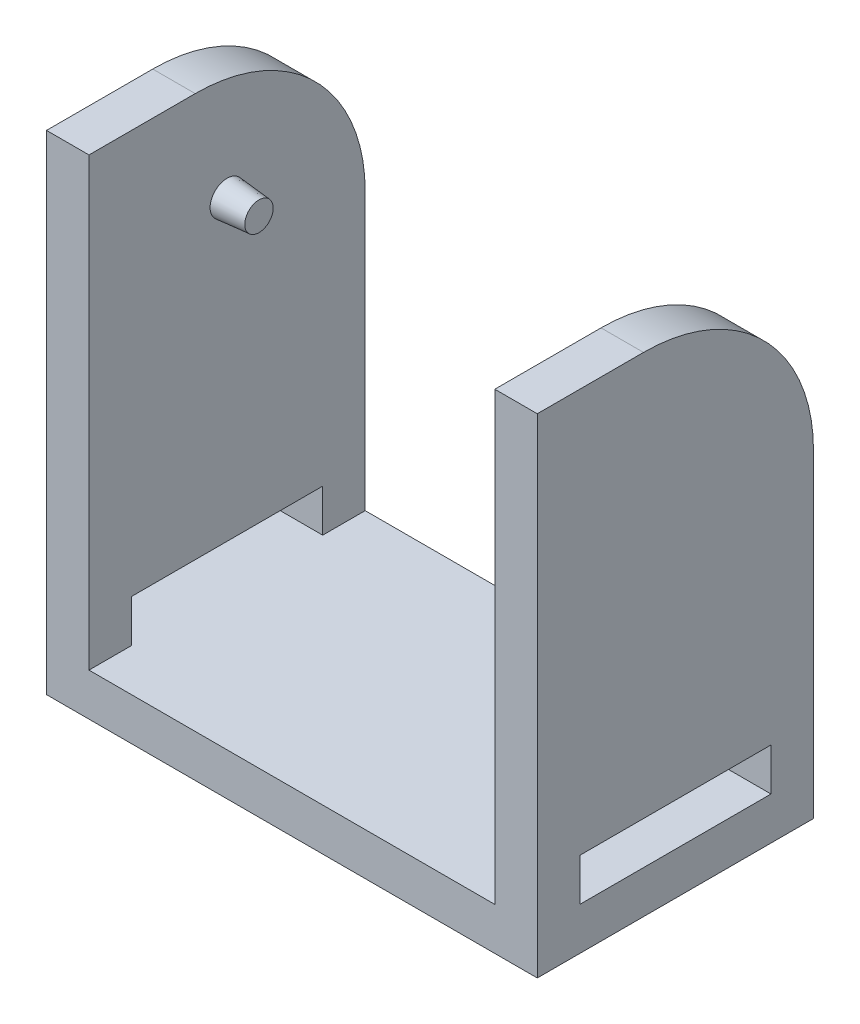
ISO-10303-21;
HEADER;
FILE_DESCRIPTION(('STEP AP214'),'2;1');
FILE_NAME('part.step','',(''),(''),'','','');
FILE_SCHEMA(('AUTOMOTIVE_DESIGN { 1 0 10303 214 1 1 1 1 }'));
ENDSEC;
DATA;
#1=APPLICATION_CONTEXT('core data for automotive mechanical design processes');
#2=APPLICATION_PROTOCOL_DEFINITION('international standard','automotive_design',2000,#1);
#3=PRODUCT_CONTEXT('',#1,'mechanical');
#4=PRODUCT('Part','Part','',(#3));
#5=PRODUCT_RELATED_PRODUCT_CATEGORY('part','',(#4));
#6=PRODUCT_DEFINITION_FORMATION('','',#4);
#7=PRODUCT_DEFINITION_CONTEXT('part definition',#1,'design');
#8=PRODUCT_DEFINITION('design','',#6,#7);
#9=PRODUCT_DEFINITION_SHAPE('','',#8);
#10=(LENGTH_UNIT() NAMED_UNIT(*) SI_UNIT(.MILLI.,.METRE.));
#11=(NAMED_UNIT(*) PLANE_ANGLE_UNIT() SI_UNIT($,.RADIAN.));
#12=(NAMED_UNIT(*) SI_UNIT($,.STERADIAN.) SOLID_ANGLE_UNIT());
#13=UNCERTAINTY_MEASURE_WITH_UNIT(LENGTH_MEASURE(1.E-05),#10,'distance_accuracy_value','');
#14=(GEOMETRIC_REPRESENTATION_CONTEXT(3) GLOBAL_UNCERTAINTY_ASSIGNED_CONTEXT((#13)) GLOBAL_UNIT_ASSIGNED_CONTEXT((#10,
#11,#12)) REPRESENTATION_CONTEXT('',''));
#15=CARTESIAN_POINT('',(0.,0.,0.));
#16=DIRECTION('',(0.,0.,1.));
#17=DIRECTION('',(1.,0.,0.));
#18=AXIS2_PLACEMENT_3D('',#15,#16,#17);
#19=CARTESIAN_POINT('',(11.55,15.,1.5));
#20=DIRECTION('',(1.,0.,0.));
#21=DIRECTION('',(0.,0.,1.));
#22=AXIS2_PLACEMENT_3D('',#19,#20,#21);
#23=PLANE('',#22);
#24=DIRECTION('',(0.,0.,1.));
#25=VECTOR('',#24,1.);
#26=CARTESIAN_POINT('',(11.55,0.,-6.5));
#27=LINE('',#26,#25);
#28=CARTESIAN_POINT('',(11.55,0.,-6.5));
#29=VERTEX_POINT('',#28);
#30=CARTESIAN_POINT('',(11.55,0.,6.5));
#31=VERTEX_POINT('',#30);
#32=EDGE_CURVE('E216',#29,#31,#27,.T.);
#33=ORIENTED_EDGE('',*,*,#32,.F.);
#34=DIRECTION('',(0.,-1.,0.));
#35=VECTOR('',#34,1.);
#36=CARTESIAN_POINT('',(11.55,14.9999999999999,-6.5));
#37=LINE('',#36,#35);
#38=CARTESIAN_POINT('',(11.55,14.9999999999999,-6.5));
#39=VERTEX_POINT('',#38);
#40=EDGE_CURVE('E220',#39,#29,#37,.T.);
#41=ORIENTED_EDGE('',*,*,#40,.F.);
#42=CARTESIAN_POINT('',(11.55,15.,1.5));
#43=DIRECTION('',(-1.,0.,0.));
#44=DIRECTION('',(0.,0.,1.));
#45=AXIS2_PLACEMENT_3D('',#42,#43,#44);
#46=CIRCLE('',#45,8.);
#47=CARTESIAN_POINT('',(11.55,23.,1.50000000000006));
#48=VERTEX_POINT('',#47);
#49=EDGE_CURVE('E225',#48,#39,#46,.T.);
#50=ORIENTED_EDGE('',*,*,#49,.F.);
#51=DIRECTION('',(0.,0.,-1.));
#52=VECTOR('',#51,1.);
#53=CARTESIAN_POINT('',(11.55,23.,6.5));
#54=LINE('',#53,#52);
#55=CARTESIAN_POINT('',(11.55,23.,6.5));
#56=VERTEX_POINT('',#55);
#57=EDGE_CURVE('E229',#56,#48,#54,.T.);
#58=ORIENTED_EDGE('',*,*,#57,.F.);
#59=DIRECTION('',(0.,1.,0.));
#60=VECTOR('',#59,1.);
#61=CARTESIAN_POINT('',(11.55,0.,6.5));
#62=LINE('',#61,#60);
#63=EDGE_CURVE('E233',#31,#56,#62,.T.);
#64=ORIENTED_EDGE('',*,*,#63,.F.);
#65=EDGE_LOOP('',(#33,#41,#50,#58,#64));
#66=FACE_BOUND('',#65,.T.);
#67=DIRECTION('',(0.,0.,-1.));
#68=VECTOR('',#67,1.);
#69=CARTESIAN_POINT('',(11.55,2.,4.5));
#70=LINE('',#69,#68);
#71=CARTESIAN_POINT('',(11.55,2.,4.5));
#72=VERTEX_POINT('',#71);
#73=CARTESIAN_POINT('',(11.55,2.,-4.5));
#74=VERTEX_POINT('',#73);
#75=EDGE_CURVE('E172',#72,#74,#70,.T.);
#76=ORIENTED_EDGE('',*,*,#75,.F.);
#77=DIRECTION('',(0.,-1.,0.));
#78=VECTOR('',#77,1.);
#79=CARTESIAN_POINT('',(11.55,2.,4.5));
#80=LINE('',#79,#78);
#81=CARTESIAN_POINT('',(11.55,4.,4.5));
#82=VERTEX_POINT('',#81);
#83=EDGE_CURVE('E179',#82,#72,#80,.T.);
#84=ORIENTED_EDGE('',*,*,#83,.F.);
#85=DIRECTION('',(0.,0.,1.));
#86=VECTOR('',#85,1.);
#87=CARTESIAN_POINT('',(11.55,4.,4.5));
#88=LINE('',#87,#86);
#89=CARTESIAN_POINT('',(11.55,4.,-4.5));
#90=VERTEX_POINT('',#89);
#91=EDGE_CURVE('E186',#90,#82,#88,.T.);
#92=ORIENTED_EDGE('',*,*,#91,.F.);
#93=DIRECTION('',(0.,1.,0.));
#94=VECTOR('',#93,1.);
#95=CARTESIAN_POINT('',(11.55,2.,-4.5));
#96=LINE('',#95,#94);
#97=EDGE_CURVE('E57',#74,#90,#96,.T.);
#98=ORIENTED_EDGE('',*,*,#97,.F.);
#99=EDGE_LOOP('',(#76,#84,#92,#98));
#100=FACE_BOUND('',#99,.T.);
#101=ADVANCED_FACE('F41',(#66,#100),#23,.T.);
#102=CARTESIAN_POINT('',(9.55,15.,1.5));
#103=DIRECTION('',(1.,0.,0.));
#104=DIRECTION('',(0.,0.,1.));
#105=AXIS2_PLACEMENT_3D('',#102,#103,#104);
#106=PLANE('',#105);
#107=CARTESIAN_POINT('',(9.55,18.,0.));
#108=DIRECTION('',(1.,0.,0.));
#109=DIRECTION('',(0.,0.,-1.));
#110=AXIS2_PLACEMENT_3D('',#107,#108,#109);
#111=CIRCLE('',#110,0.8);
#112=CARTESIAN_POINT('',(9.55,18.,-0.8));
#113=VERTEX_POINT('',#112);
#114=EDGE_CURVE('E193',#113,#113,#111,.T.);
#115=ORIENTED_EDGE('',*,*,#114,.T.);
#116=EDGE_LOOP('',(#115));
#117=FACE_BOUND('',#116,.T.);
#118=DIRECTION('',(0.,-1.,0.));
#119=VECTOR('',#118,1.);
#120=CARTESIAN_POINT('',(9.55,2.,4.5));
#121=LINE('',#120,#119);
#122=CARTESIAN_POINT('',(9.55,4.,4.5));
#123=VERTEX_POINT('',#122);
#124=CARTESIAN_POINT('',(9.55,2.,4.5));
#125=VERTEX_POINT('',#124);
#126=EDGE_CURVE('E65',#123,#125,#121,.T.);
#127=ORIENTED_EDGE('',*,*,#126,.T.);
#128=DIRECTION('',(0.,0.,-1.));
#129=VECTOR('',#128,1.);
#130=CARTESIAN_POINT('',(9.55,2.,6.5));
#131=LINE('',#130,#129);
#132=CARTESIAN_POINT('',(9.55,2.,6.5));
#133=VERTEX_POINT('',#132);
#134=EDGE_CURVE('E174',#133,#125,#131,.T.);
#135=ORIENTED_EDGE('',*,*,#134,.F.);
#136=DIRECTION('',(0.,1.,0.));
#137=VECTOR('',#136,1.);
#138=CARTESIAN_POINT('',(9.55,0.,6.5));
#139=LINE('',#138,#137);
#140=CARTESIAN_POINT('',(9.55,23.,6.5));
#141=VERTEX_POINT('',#140);
#142=EDGE_CURVE('E221',#133,#141,#139,.T.);
#143=ORIENTED_EDGE('',*,*,#142,.T.);
#144=DIRECTION('',(0.,0.,-1.));
#145=VECTOR('',#144,1.);
#146=CARTESIAN_POINT('',(9.55,23.,6.5));
#147=LINE('',#146,#145);
#148=CARTESIAN_POINT('',(9.55,23.,1.50000000000006));
#149=VERTEX_POINT('',#148);
#150=EDGE_CURVE('E245',#141,#149,#147,.T.);
#151=ORIENTED_EDGE('',*,*,#150,.T.);
#152=CARTESIAN_POINT('',(9.55,15.,1.5));
#153=DIRECTION('',(-1.,0.,0.));
#154=DIRECTION('',(0.,0.,1.));
#155=AXIS2_PLACEMENT_3D('',#152,#153,#154);
#156=CIRCLE('',#155,8.);
#157=CARTESIAN_POINT('',(9.55,14.9999999999999,-6.5));
#158=VERTEX_POINT('',#157);
#159=EDGE_CURVE('E241',#149,#158,#156,.T.);
#160=ORIENTED_EDGE('',*,*,#159,.T.);
#161=DIRECTION('',(0.,-1.,0.));
#162=VECTOR('',#161,1.);
#163=CARTESIAN_POINT('',(9.55,14.9999999999999,-6.5));
#164=LINE('',#163,#162);
#165=CARTESIAN_POINT('',(9.55,2.,-6.5));
#166=VERTEX_POINT('',#165);
#167=EDGE_CURVE('E215',#158,#166,#164,.T.);
#168=ORIENTED_EDGE('',*,*,#167,.T.);
#169=CARTESIAN_POINT('',(9.55,2.,-4.5));
#170=VERTEX_POINT('',#169);
#171=EDGE_CURVE('E353',#170,#166,#131,.T.);
#172=ORIENTED_EDGE('',*,*,#171,.F.);
#173=DIRECTION('',(0.,1.,0.));
#174=VECTOR('',#173,1.);
#175=CARTESIAN_POINT('',(9.55,2.,-4.5));
#176=LINE('',#175,#174);
#177=CARTESIAN_POINT('',(9.55,4.,-4.5));
#178=VERTEX_POINT('',#177);
#179=EDGE_CURVE('E202',#170,#178,#176,.T.);
#180=ORIENTED_EDGE('',*,*,#179,.T.);
#181=DIRECTION('',(0.,0.,1.));
#182=VECTOR('',#181,1.);
#183=CARTESIAN_POINT('',(9.55,4.,4.5));
#184=LINE('',#183,#182);
#185=EDGE_CURVE('E198',#178,#123,#184,.T.);
#186=ORIENTED_EDGE('',*,*,#185,.T.);
#187=EDGE_LOOP('',(#127,#135,#143,#151,#160,#168,#172,#180,#186));
#188=FACE_BOUND('',#187,.T.);
#189=ADVANCED_FACE('F380',(#117,#188),#106,.F.);
#190=CARTESIAN_POINT('',(9.55,2.,6.5));
#191=DIRECTION('',(0.,0.,-1.));
#192=DIRECTION('',(-1.,0.,0.));
#193=AXIS2_PLACEMENT_3D('',#190,#191,#192);
#194=PLANE('',#193);
#195=DIRECTION('',(1.,0.,0.));
#196=VECTOR('',#195,1.);
#197=CARTESIAN_POINT('',(9.55,0.,6.5));
#198=LINE('',#197,#196);
#199=CARTESIAN_POINT('',(-11.55,0.,6.5));
#200=VERTEX_POINT('',#199);
#201=EDGE_CURVE('E345',#200,#31,#198,.T.);
#202=ORIENTED_EDGE('',*,*,#201,.T.);
#203=ORIENTED_EDGE('',*,*,#63,.T.);
#204=DIRECTION('',(-1.,0.,0.));
#205=VECTOR('',#204,1.);
#206=CARTESIAN_POINT('',(11.55,23.,6.5));
#207=LINE('',#206,#205);
#208=EDGE_CURVE('E237',#56,#141,#207,.T.);
#209=ORIENTED_EDGE('',*,*,#208,.T.);
#210=ORIENTED_EDGE('',*,*,#142,.F.);
#211=DIRECTION('',(1.,0.,0.));
#212=VECTOR('',#211,1.);
#213=CARTESIAN_POINT('',(9.55,2.,6.5));
#214=LINE('',#213,#212);
#215=CARTESIAN_POINT('',(-9.55,2.,6.5));
#216=VERTEX_POINT('',#215);
#217=EDGE_CURVE('E349',#216,#133,#214,.T.);
#218=ORIENTED_EDGE('',*,*,#217,.F.);
#219=DIRECTION('',(0.,1.,0.));
#220=VECTOR('',#219,1.);
#221=CARTESIAN_POINT('',(-9.55,0.,6.5));
#222=LINE('',#221,#220);
#223=CARTESIAN_POINT('',(-9.55,23.,6.5));
#224=VERTEX_POINT('',#223);
#225=EDGE_CURVE('E303',#216,#224,#222,.T.);
#226=ORIENTED_EDGE('',*,*,#225,.T.);
#227=DIRECTION('',(1.,0.,0.));
#228=VECTOR('',#227,1.);
#229=CARTESIAN_POINT('',(-11.55,23.,6.5));
#230=LINE('',#229,#228);
#231=CARTESIAN_POINT('',(-11.55,23.,6.5));
#232=VERTEX_POINT('',#231);
#233=EDGE_CURVE('E341',#232,#224,#230,.T.);
#234=ORIENTED_EDGE('',*,*,#233,.F.);
#235=DIRECTION('',(0.,1.,0.));
#236=VECTOR('',#235,1.);
#237=CARTESIAN_POINT('',(-11.55,0.,6.5));
#238=LINE('',#237,#236);
#239=EDGE_CURVE('E308',#200,#232,#238,.T.);
#240=ORIENTED_EDGE('',*,*,#239,.F.);
#241=EDGE_LOOP('',(#202,#203,#209,#210,#218,#226,#234,#240));
#242=FACE_BOUND('',#241,.T.);
#243=ADVANCED_FACE('F43',(#242),#194,.F.);
#244=CARTESIAN_POINT('',(9.55,2.,-6.5));
#245=DIRECTION('',(0.,0.,1.));
#246=DIRECTION('',(1.,0.,0.));
#247=AXIS2_PLACEMENT_3D('',#244,#245,#246);
#248=PLANE('',#247);
#249=DIRECTION('',(-1.,0.,0.));
#250=VECTOR('',#249,1.);
#251=CARTESIAN_POINT('',(9.55,0.,-6.5));
#252=LINE('',#251,#250);
#253=CARTESIAN_POINT('',(-11.55,0.,-6.5));
#254=VERTEX_POINT('',#253);
#255=EDGE_CURVE('E360',#29,#254,#252,.T.);
#256=ORIENTED_EDGE('',*,*,#255,.T.);
#257=DIRECTION('',(0.,-1.,0.));
#258=VECTOR('',#257,1.);
#259=CARTESIAN_POINT('',(-11.55,14.9999999999999,-6.5));
#260=LINE('',#259,#258);
#261=CARTESIAN_POINT('',(-11.55,14.9999999999999,-6.5));
#262=VERTEX_POINT('',#261);
#263=EDGE_CURVE('E318',#262,#254,#260,.T.);
#264=ORIENTED_EDGE('',*,*,#263,.F.);
#265=DIRECTION('',(1.,0.,0.));
#266=VECTOR('',#265,1.);
#267=CARTESIAN_POINT('',(-11.55,14.9999999999999,-6.5));
#268=LINE('',#267,#266);
#269=CARTESIAN_POINT('',(-9.55,14.9999999999999,-6.5));
#270=VERTEX_POINT('',#269);
#271=EDGE_CURVE('E322',#262,#270,#268,.T.);
#272=ORIENTED_EDGE('',*,*,#271,.T.);
#273=DIRECTION('',(0.,-1.,0.));
#274=VECTOR('',#273,1.);
#275=CARTESIAN_POINT('',(-9.55,14.9999999999999,-6.5));
#276=LINE('',#275,#274);
#277=CARTESIAN_POINT('',(-9.55,2.,-6.5));
#278=VERTEX_POINT('',#277);
#279=EDGE_CURVE('E309',#270,#278,#276,.T.);
#280=ORIENTED_EDGE('',*,*,#279,.T.);
#281=DIRECTION('',(-1.,0.,0.));
#282=VECTOR('',#281,1.);
#283=CARTESIAN_POINT('',(9.55,2.,-6.5));
#284=LINE('',#283,#282);
#285=EDGE_CURVE('E50',#166,#278,#284,.T.);
#286=ORIENTED_EDGE('',*,*,#285,.F.);
#287=ORIENTED_EDGE('',*,*,#167,.F.);
#288=DIRECTION('',(-1.,0.,0.));
#289=VECTOR('',#288,1.);
#290=CARTESIAN_POINT('',(11.55,14.9999999999999,-6.5));
#291=LINE('',#290,#289);
#292=EDGE_CURVE('E257',#39,#158,#291,.T.);
#293=ORIENTED_EDGE('',*,*,#292,.F.);
#294=ORIENTED_EDGE('',*,*,#40,.T.);
#295=EDGE_LOOP('',(#256,#264,#272,#280,#286,#287,#293,#294));
#296=FACE_BOUND('',#295,.T.);
#297=ADVANCED_FACE('F458',(#296),#248,.F.);
#298=CARTESIAN_POINT('',(0.,2.,0.));
#299=DIRECTION('',(0.,1.,0.));
#300=DIRECTION('',(0.,0.,1.));
#301=AXIS2_PLACEMENT_3D('',#298,#299,#300);
#302=PLANE('',#301);
#303=DIRECTION('',(0.,0.,1.));
#304=VECTOR('',#303,1.);
#305=CARTESIAN_POINT('',(-9.55,2.,6.5));
#306=LINE('',#305,#304);
#307=CARTESIAN_POINT('',(-9.55,2.,-4.5));
#308=VERTEX_POINT('',#307);
#309=EDGE_CURVE('E346',#278,#308,#306,.T.);
#310=ORIENTED_EDGE('',*,*,#309,.T.);
#311=DIRECTION('',(1.,0.,0.));
#312=VECTOR('',#311,1.);
#313=CARTESIAN_POINT('',(-20.7695444572929,2.,-4.5));
#314=LINE('',#313,#312);
#315=CARTESIAN_POINT('',(-11.55,2.,-4.5));
#316=VERTEX_POINT('',#315);
#317=EDGE_CURVE('E274',#316,#308,#314,.T.);
#318=ORIENTED_EDGE('',*,*,#317,.F.);
#319=DIRECTION('',(0.,0.,-1.));
#320=VECTOR('',#319,1.);
#321=CARTESIAN_POINT('',(-11.55,2.,4.5));
#322=LINE('',#321,#320);
#323=CARTESIAN_POINT('',(-11.55,2.,4.5));
#324=VERTEX_POINT('',#323);
#325=EDGE_CURVE('E264',#324,#316,#322,.T.);
#326=ORIENTED_EDGE('',*,*,#325,.F.);
#327=DIRECTION('',(1.,0.,0.));
#328=VECTOR('',#327,1.);
#329=CARTESIAN_POINT('',(-20.7695444572929,2.,4.5));
#330=LINE('',#329,#328);
#331=CARTESIAN_POINT('',(-9.55,2.,4.5));
#332=VERTEX_POINT('',#331);
#333=EDGE_CURVE('E279',#324,#332,#330,.T.);
#334=ORIENTED_EDGE('',*,*,#333,.T.);
#335=EDGE_CURVE('E350',#332,#216,#306,.T.);
#336=ORIENTED_EDGE('',*,*,#335,.T.);
#337=ORIENTED_EDGE('',*,*,#217,.T.);
#338=ORIENTED_EDGE('',*,*,#134,.T.);
#339=DIRECTION('',(-1.,0.,0.));
#340=VECTOR('',#339,1.);
#341=CARTESIAN_POINT('',(39.8695444572929,2.,4.5));
#342=LINE('',#341,#340);
#343=EDGE_CURVE('E167',#72,#125,#342,.T.);
#344=ORIENTED_EDGE('',*,*,#343,.F.);
#345=ORIENTED_EDGE('',*,*,#75,.T.);
#346=DIRECTION('',(-1.,0.,0.));
#347=VECTOR('',#346,1.);
#348=CARTESIAN_POINT('',(39.8695444572929,2.,-4.5));
#349=LINE('',#348,#347);
#350=EDGE_CURVE('E176',#74,#170,#349,.T.);
#351=ORIENTED_EDGE('',*,*,#350,.T.);
#352=ORIENTED_EDGE('',*,*,#171,.T.);
#353=ORIENTED_EDGE('',*,*,#285,.T.);
#354=EDGE_LOOP('',(#310,#318,#326,#334,#336,#337,#338,#344,#345,#351,#352,#353));
#355=FACE_BOUND('',#354,.T.);
#356=ADVANCED_FACE('F170',(#355),#302,.T.);
#357=CARTESIAN_POINT('',(0.,0.,0.));
#358=DIRECTION('',(0.,1.,0.));
#359=DIRECTION('',(0.,0.,1.));
#360=AXIS2_PLACEMENT_3D('',#357,#358,#359);
#361=PLANE('',#360);
#362=ORIENTED_EDGE('',*,*,#201,.F.);
#363=DIRECTION('',(0.,0.,1.));
#364=VECTOR('',#363,1.);
#365=CARTESIAN_POINT('',(-11.55,0.,-6.5));
#366=LINE('',#365,#364);
#367=EDGE_CURVE('E304',#254,#200,#366,.T.);
#368=ORIENTED_EDGE('',*,*,#367,.F.);
#369=ORIENTED_EDGE('',*,*,#255,.F.);
#370=ORIENTED_EDGE('',*,*,#32,.T.);
#371=EDGE_LOOP('',(#362,#368,#369,#370));
#372=FACE_BOUND('',#371,.T.);
#373=ADVANCED_FACE('F454',(#372),#361,.F.);
#374=CARTESIAN_POINT('',(-11.55,23.,6.5));
#375=DIRECTION('',(0.,-1.,0.));
#376=DIRECTION('',(0.,0.,-1.));
#377=AXIS2_PLACEMENT_3D('',#374,#375,#376);
#378=PLANE('',#377);
#379=DIRECTION('',(0.,0.,-1.));
#380=VECTOR('',#379,1.);
#381=CARTESIAN_POINT('',(-9.55,23.,6.5));
#382=LINE('',#381,#380);
#383=CARTESIAN_POINT('',(-9.55,23.,1.50000000000006));
#384=VERTEX_POINT('',#383);
#385=EDGE_CURVE('E325',#224,#384,#382,.T.);
#386=ORIENTED_EDGE('',*,*,#385,.T.);
#387=DIRECTION('',(1.,0.,0.));
#388=VECTOR('',#387,1.);
#389=CARTESIAN_POINT('',(-11.55,23.,1.50000000000006));
#390=LINE('',#389,#388);
#391=CARTESIAN_POINT('',(-11.55,23.,1.50000000000006));
#392=VERTEX_POINT('',#391);
#393=EDGE_CURVE('E337',#392,#384,#390,.T.);
#394=ORIENTED_EDGE('',*,*,#393,.F.);
#395=DIRECTION('',(0.,0.,-1.));
#396=VECTOR('',#395,1.);
#397=CARTESIAN_POINT('',(-11.55,23.,6.5));
#398=LINE('',#397,#396);
#399=EDGE_CURVE('E312',#232,#392,#398,.T.);
#400=ORIENTED_EDGE('',*,*,#399,.F.);
#401=ORIENTED_EDGE('',*,*,#233,.T.);
#402=EDGE_LOOP('',(#386,#394,#400,#401));
#403=FACE_BOUND('',#402,.T.);
#404=ADVANCED_FACE('F450',(#403),#378,.F.);
#405=CARTESIAN_POINT('',(-11.55,15.,1.5));
#406=DIRECTION('',(1.,0.,0.));
#407=DIRECTION('',(0.,0.,-1.));
#408=AXIS2_PLACEMENT_3D('',#405,#406,#407);
#409=CYLINDRICAL_SURFACE('',#408,8.);
#410=CARTESIAN_POINT('',(-9.55,15.,1.5));
#411=DIRECTION('',(-1.,0.,0.));
#412=DIRECTION('',(0.,0.,1.));
#413=AXIS2_PLACEMENT_3D('',#410,#411,#412);
#414=CIRCLE('',#413,8.);
#415=EDGE_CURVE('E328',#384,#270,#414,.T.);
#416=ORIENTED_EDGE('',*,*,#415,.T.);
#417=ORIENTED_EDGE('',*,*,#271,.F.);
#418=CARTESIAN_POINT('',(-11.55,15.,1.5));
#419=DIRECTION('',(-1.,0.,0.));
#420=DIRECTION('',(0.,0.,1.));
#421=AXIS2_PLACEMENT_3D('',#418,#419,#420);
#422=CIRCLE('',#421,8.);
#423=EDGE_CURVE('E315',#392,#262,#422,.T.);
#424=ORIENTED_EDGE('',*,*,#423,.F.);
#425=ORIENTED_EDGE('',*,*,#393,.T.);
#426=EDGE_LOOP('',(#416,#417,#424,#425));
#427=FACE_BOUND('',#426,.T.);
#428=ADVANCED_FACE('F443',(#427),#409,.T.);
#429=CARTESIAN_POINT('',(-11.55,15.,1.5));
#430=DIRECTION('',(-1.,0.,0.));
#431=DIRECTION('',(0.,0.,1.));
#432=AXIS2_PLACEMENT_3D('',#429,#430,#431);
#433=PLANE('',#432);
#434=ORIENTED_EDGE('',*,*,#325,.T.);
#435=DIRECTION('',(0.,1.,0.));
#436=VECTOR('',#435,1.);
#437=CARTESIAN_POINT('',(-11.55,2.,-4.5));
#438=LINE('',#437,#436);
#439=CARTESIAN_POINT('',(-11.55,4.,-4.5));
#440=VERTEX_POINT('',#439);
#441=EDGE_CURVE('E286',#316,#440,#438,.T.);
#442=ORIENTED_EDGE('',*,*,#441,.T.);
#443=DIRECTION('',(0.,0.,1.));
#444=VECTOR('',#443,1.);
#445=CARTESIAN_POINT('',(-11.55,4.,4.5));
#446=LINE('',#445,#444);
#447=CARTESIAN_POINT('',(-11.55,4.,4.5));
#448=VERTEX_POINT('',#447);
#449=EDGE_CURVE('E281',#440,#448,#446,.T.);
#450=ORIENTED_EDGE('',*,*,#449,.T.);
#451=DIRECTION('',(0.,-1.,0.));
#452=VECTOR('',#451,1.);
#453=CARTESIAN_POINT('',(-11.55,2.,4.5));
#454=LINE('',#453,#452);
#455=EDGE_CURVE('E275',#448,#324,#454,.T.);
#456=ORIENTED_EDGE('',*,*,#455,.T.);
#457=EDGE_LOOP('',(#434,#442,#450,#456));
#458=FACE_BOUND('',#457,.T.);
#459=ORIENTED_EDGE('',*,*,#367,.T.);
#460=ORIENTED_EDGE('',*,*,#239,.T.);
#461=ORIENTED_EDGE('',*,*,#399,.T.);
#462=ORIENTED_EDGE('',*,*,#423,.T.);
#463=ORIENTED_EDGE('',*,*,#263,.T.);
#464=EDGE_LOOP('',(#459,#460,#461,#462,#463));
#465=FACE_BOUND('',#464,.T.);
#466=ADVANCED_FACE('F440',(#458,#465),#433,.T.);
#467=CARTESIAN_POINT('',(-9.55,15.,1.5));
#468=DIRECTION('',(-1.,0.,0.));
#469=DIRECTION('',(0.,0.,1.));
#470=AXIS2_PLACEMENT_3D('',#467,#468,#469);
#471=PLANE('',#470);
#472=CARTESIAN_POINT('',(-9.55,18.,0.));
#473=DIRECTION('',(-1.,0.,0.));
#474=DIRECTION('',(0.,0.,1.));
#475=AXIS2_PLACEMENT_3D('',#472,#473,#474);
#476=CIRCLE('',#475,0.8);
#477=CARTESIAN_POINT('',(-9.55,18.,0.8));
#478=VERTEX_POINT('',#477);
#479=EDGE_CURVE('E11',#478,#478,#476,.F.);
#480=ORIENTED_EDGE('',*,*,#479,.F.);
#481=EDGE_LOOP('',(#480));
#482=FACE_BOUND('',#481,.T.);
#483=DIRECTION('',(0.,0.,1.));
#484=VECTOR('',#483,1.);
#485=CARTESIAN_POINT('',(-9.55,4.,4.5));
#486=LINE('',#485,#484);
#487=CARTESIAN_POINT('',(-9.55,4.,-4.5));
#488=VERTEX_POINT('',#487);
#489=CARTESIAN_POINT('',(-9.55,4.,4.5));
#490=VERTEX_POINT('',#489);
#491=EDGE_CURVE('E261',#488,#490,#486,.T.);
#492=ORIENTED_EDGE('',*,*,#491,.F.);
#493=DIRECTION('',(0.,1.,0.));
#494=VECTOR('',#493,1.);
#495=CARTESIAN_POINT('',(-9.55,2.,-4.5));
#496=LINE('',#495,#494);
#497=EDGE_CURVE('E265',#308,#488,#496,.T.);
#498=ORIENTED_EDGE('',*,*,#497,.F.);
#499=ORIENTED_EDGE('',*,*,#309,.F.);
#500=ORIENTED_EDGE('',*,*,#279,.F.);
#501=ORIENTED_EDGE('',*,*,#415,.F.);
#502=ORIENTED_EDGE('',*,*,#385,.F.);
#503=ORIENTED_EDGE('',*,*,#225,.F.);
#504=ORIENTED_EDGE('',*,*,#335,.F.);
#505=DIRECTION('',(0.,-1.,0.));
#506=VECTOR('',#505,1.);
#507=CARTESIAN_POINT('',(-9.55,2.,4.5));
#508=LINE('',#507,#506);
#509=EDGE_CURVE('E260',#490,#332,#508,.T.);
#510=ORIENTED_EDGE('',*,*,#509,.F.);
#511=EDGE_LOOP('',(#492,#498,#499,#500,#501,#502,#503,#504,#510));
#512=FACE_BOUND('',#511,.T.);
#513=ADVANCED_FACE('F373',(#482,#512),#471,.F.);
#514=CARTESIAN_POINT('',(-9.55,18.,0.));
#515=DIRECTION('',(-1.,0.,0.));
#516=DIRECTION('',(0.,0.,-1.));
#517=AXIS2_PLACEMENT_3D('',#514,#515,#516);
#518=CONICAL_SURFACE('',#517,0.8,0.0872664625997165);
#519=CARTESIAN_POINT('',(-8.05,18.,0.));
#520=DIRECTION('',(1.,0.,0.));
#521=DIRECTION('',(0.,0.,-1.));
#522=AXIS2_PLACEMENT_3D('',#519,#520,#521);
#523=CIRCLE('',#522,0.668767004711114);
#524=CARTESIAN_POINT('',(-8.05,18.,-0.668767004711114));
#525=VERTEX_POINT('',#524);
#526=EDGE_CURVE('E299',#525,#525,#523,.T.);
#527=ORIENTED_EDGE('',*,*,#526,.F.);
#528=EDGE_LOOP('',(#527));
#529=FACE_BOUND('',#528,.T.);
#530=ORIENTED_EDGE('',*,*,#479,.T.);
#531=EDGE_LOOP('',(#530));
#532=FACE_BOUND('',#531,.T.);
#533=ADVANCED_FACE('F435',(#529,#532),#518,.T.);
#534=CARTESIAN_POINT('',(-8.05,18.,0.));
#535=DIRECTION('',(1.,0.,0.));
#536=DIRECTION('',(0.,0.,-1.));
#537=AXIS2_PLACEMENT_3D('',#534,#535,#536);
#538=PLANE('',#537);
#539=ORIENTED_EDGE('',*,*,#526,.T.);
#540=EDGE_LOOP('',(#539));
#541=FACE_BOUND('',#540,.T.);
#542=ADVANCED_FACE('F431',(#541),#538,.T.);
#543=CARTESIAN_POINT('',(-20.7695444572929,2.,-4.5));
#544=DIRECTION('',(0.,0.,-1.));
#545=DIRECTION('',(-1.,0.,0.));
#546=AXIS2_PLACEMENT_3D('',#543,#544,#545);
#547=PLANE('',#546);
#548=ORIENTED_EDGE('',*,*,#317,.T.);
#549=ORIENTED_EDGE('',*,*,#497,.T.);
#550=DIRECTION('',(1.,0.,0.));
#551=VECTOR('',#550,1.);
#552=CARTESIAN_POINT('',(-20.7695444572929,4.,-4.5));
#553=LINE('',#552,#551);
#554=EDGE_CURVE('E285',#440,#488,#553,.T.);
#555=ORIENTED_EDGE('',*,*,#554,.F.);
#556=ORIENTED_EDGE('',*,*,#441,.F.);
#557=EDGE_LOOP('',(#548,#549,#555,#556));
#558=FACE_BOUND('',#557,.T.);
#559=ADVANCED_FACE('F427',(#558),#547,.F.);
#560=CARTESIAN_POINT('',(-20.7695444572929,4.,4.5));
#561=DIRECTION('',(0.,1.,0.));
#562=DIRECTION('',(0.,0.,1.));
#563=AXIS2_PLACEMENT_3D('',#560,#561,#562);
#564=PLANE('',#563);
#565=ORIENTED_EDGE('',*,*,#554,.T.);
#566=ORIENTED_EDGE('',*,*,#491,.T.);
#567=DIRECTION('',(1.,0.,0.));
#568=VECTOR('',#567,1.);
#569=CARTESIAN_POINT('',(-20.7695444572929,4.,4.5));
#570=LINE('',#569,#568);
#571=EDGE_CURVE('E280',#448,#490,#570,.T.);
#572=ORIENTED_EDGE('',*,*,#571,.F.);
#573=ORIENTED_EDGE('',*,*,#449,.F.);
#574=EDGE_LOOP('',(#565,#566,#572,#573));
#575=FACE_BOUND('',#574,.T.);
#576=ADVANCED_FACE('F423',(#575),#564,.F.);
#577=CARTESIAN_POINT('',(-20.7695444572929,2.,4.5));
#578=DIRECTION('',(0.,0.,1.));
#579=DIRECTION('',(1.,0.,0.));
#580=AXIS2_PLACEMENT_3D('',#577,#578,#579);
#581=PLANE('',#580);
#582=ORIENTED_EDGE('',*,*,#571,.T.);
#583=ORIENTED_EDGE('',*,*,#509,.T.);
#584=ORIENTED_EDGE('',*,*,#333,.F.);
#585=ORIENTED_EDGE('',*,*,#455,.F.);
#586=EDGE_LOOP('',(#582,#583,#584,#585));
#587=FACE_BOUND('',#586,.T.);
#588=ADVANCED_FACE('F419',(#587),#581,.F.);
#589=CARTESIAN_POINT('',(11.55,15.,1.5));
#590=DIRECTION('',(-1.,0.,0.));
#591=DIRECTION('',(0.,0.,1.));
#592=AXIS2_PLACEMENT_3D('',#589,#590,#591);
#593=CYLINDRICAL_SURFACE('',#592,8.);
#594=ORIENTED_EDGE('',*,*,#159,.F.);
#595=DIRECTION('',(-1.,0.,0.));
#596=VECTOR('',#595,1.);
#597=CARTESIAN_POINT('',(11.55,23.,1.50000000000006));
#598=LINE('',#597,#596);
#599=EDGE_CURVE('E254',#48,#149,#598,.T.);
#600=ORIENTED_EDGE('',*,*,#599,.F.);
#601=ORIENTED_EDGE('',*,*,#49,.T.);
#602=ORIENTED_EDGE('',*,*,#292,.T.);
#603=EDGE_LOOP('',(#594,#600,#601,#602));
#604=FACE_BOUND('',#603,.T.);
#605=ADVANCED_FACE('F415',(#604),#593,.T.);
#606=CARTESIAN_POINT('',(11.55,23.,6.5));
#607=DIRECTION('',(0.,1.,0.));
#608=DIRECTION('',(0.,0.,1.));
#609=AXIS2_PLACEMENT_3D('',#606,#607,#608);
#610=PLANE('',#609);
#611=ORIENTED_EDGE('',*,*,#150,.F.);
#612=ORIENTED_EDGE('',*,*,#208,.F.);
#613=ORIENTED_EDGE('',*,*,#57,.T.);
#614=ORIENTED_EDGE('',*,*,#599,.T.);
#615=EDGE_LOOP('',(#611,#612,#613,#614));
#616=FACE_BOUND('',#615,.T.);
#617=ADVANCED_FACE('F412',(#616),#610,.T.);
#618=CARTESIAN_POINT('',(9.55,18.,0.));
#619=DIRECTION('',(1.,0.,0.));
#620=DIRECTION('',(0.,0.,-1.));
#621=AXIS2_PLACEMENT_3D('',#618,#619,#620);
#622=CONICAL_SURFACE('',#621,0.8,0.0872664625997165);
#623=CARTESIAN_POINT('',(8.05,18.,0.));
#624=DIRECTION('',(-1.,0.,0.));
#625=DIRECTION('',(0.,0.,1.));
#626=AXIS2_PLACEMENT_3D('',#623,#624,#625);
#627=CIRCLE('',#626,0.668767004711114);
#628=CARTESIAN_POINT('',(8.05,18.,0.668767004711114));
#629=VERTEX_POINT('',#628);
#630=EDGE_CURVE('E211',#629,#629,#627,.F.);
#631=ORIENTED_EDGE('',*,*,#630,.T.);
#632=EDGE_LOOP('',(#631));
#633=FACE_BOUND('',#632,.T.);
#634=ORIENTED_EDGE('',*,*,#114,.F.);
#635=EDGE_LOOP('',(#634));
#636=FACE_BOUND('',#635,.T.);
#637=ADVANCED_FACE('F409',(#633,#636),#622,.T.);
#638=CARTESIAN_POINT('',(8.05,18.,0.));
#639=DIRECTION('',(-1.,0.,0.));
#640=DIRECTION('',(0.,0.,-1.));
#641=AXIS2_PLACEMENT_3D('',#638,#639,#640);
#642=PLANE('',#641);
#643=ORIENTED_EDGE('',*,*,#630,.F.);
#644=EDGE_LOOP('',(#643));
#645=FACE_BOUND('',#644,.T.);
#646=ADVANCED_FACE('F592',(#645),#642,.T.);
#647=CARTESIAN_POINT('',(39.8695444572929,2.,4.5));
#648=DIRECTION('',(0.,0.,-1.));
#649=DIRECTION('',(-1.,0.,0.));
#650=AXIS2_PLACEMENT_3D('',#647,#648,#649);
#651=PLANE('',#650);
#652=ORIENTED_EDGE('',*,*,#83,.T.);
#653=ORIENTED_EDGE('',*,*,#343,.T.);
#654=ORIENTED_EDGE('',*,*,#126,.F.);
#655=DIRECTION('',(-1.,0.,0.));
#656=VECTOR('',#655,1.);
#657=CARTESIAN_POINT('',(39.8695444572929,4.,4.5));
#658=LINE('',#657,#656);
#659=EDGE_CURVE('E181',#82,#123,#658,.T.);
#660=ORIENTED_EDGE('',*,*,#659,.F.);
#661=EDGE_LOOP('',(#652,#653,#654,#660));
#662=FACE_BOUND('',#661,.T.);
#663=ADVANCED_FACE('F180',(#662),#651,.T.);
#664=CARTESIAN_POINT('',(39.8695444572929,2.,-4.5));
#665=DIRECTION('',(0.,0.,1.));
#666=DIRECTION('',(1.,0.,0.));
#667=AXIS2_PLACEMENT_3D('',#664,#665,#666);
#668=PLANE('',#667);
#669=ORIENTED_EDGE('',*,*,#97,.T.);
#670=DIRECTION('',(-1.,0.,0.));
#671=VECTOR('',#670,1.);
#672=CARTESIAN_POINT('',(39.8695444572929,4.,-4.5));
#673=LINE('',#672,#671);
#674=EDGE_CURVE('E203',#90,#178,#673,.T.);
#675=ORIENTED_EDGE('',*,*,#674,.T.);
#676=ORIENTED_EDGE('',*,*,#179,.F.);
#677=ORIENTED_EDGE('',*,*,#350,.F.);
#678=EDGE_LOOP('',(#669,#675,#676,#677));
#679=FACE_BOUND('',#678,.T.);
#680=ADVANCED_FACE('F390',(#679),#668,.T.);
#681=CARTESIAN_POINT('',(39.8695444572929,4.,4.5));
#682=DIRECTION('',(0.,-1.,0.));
#683=DIRECTION('',(0.,0.,-1.));
#684=AXIS2_PLACEMENT_3D('',#681,#682,#683);
#685=PLANE('',#684);
#686=ORIENTED_EDGE('',*,*,#91,.T.);
#687=ORIENTED_EDGE('',*,*,#659,.T.);
#688=ORIENTED_EDGE('',*,*,#185,.F.);
#689=ORIENTED_EDGE('',*,*,#674,.F.);
#690=EDGE_LOOP('',(#686,#687,#688,#689));
#691=FACE_BOUND('',#690,.T.);
#692=ADVANCED_FACE('F392',(#691),#685,.T.);
#693=CLOSED_SHELL('',(#101,#189,#243,#297,#356,#373,#404,#428,#466,#513,#533,#542,#559,#576,
#588,#605,#617,#637,#646,#663,#680,#692));
#694=MANIFOLD_SOLID_BREP('B2',#693);
#695=ADVANCED_BREP_SHAPE_REPRESENTATION('',(#18,#694),#14);
#696=SHAPE_DEFINITION_REPRESENTATION(#9,#695);
ENDSEC;
END-ISO-10303-21;
